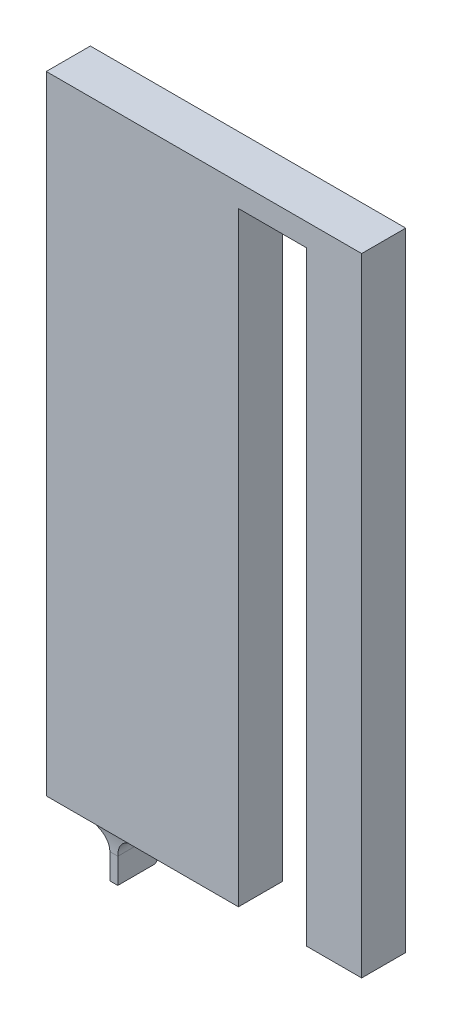
ISO-10303-21;
HEADER;
FILE_DESCRIPTION(('STEP AP214'),'2;1');
FILE_NAME('part.step','',(''),(''),'','','');
FILE_SCHEMA(('AUTOMOTIVE_DESIGN { 1 0 10303 214 1 1 1 1 }'));
ENDSEC;
DATA;
#1=APPLICATION_CONTEXT('core data for automotive mechanical design processes');
#2=APPLICATION_PROTOCOL_DEFINITION('international standard','automotive_design',2000,#1);
#3=PRODUCT_CONTEXT('',#1,'mechanical');
#4=PRODUCT('Part','Part','',(#3));
#5=PRODUCT_RELATED_PRODUCT_CATEGORY('part','',(#4));
#6=PRODUCT_DEFINITION_FORMATION('','',#4);
#7=PRODUCT_DEFINITION_CONTEXT('part definition',#1,'design');
#8=PRODUCT_DEFINITION('design','',#6,#7);
#9=PRODUCT_DEFINITION_SHAPE('','',#8);
#10=(LENGTH_UNIT() NAMED_UNIT(*) SI_UNIT(.MILLI.,.METRE.));
#11=(NAMED_UNIT(*) PLANE_ANGLE_UNIT() SI_UNIT($,.RADIAN.));
#12=(NAMED_UNIT(*) SI_UNIT($,.STERADIAN.) SOLID_ANGLE_UNIT());
#13=UNCERTAINTY_MEASURE_WITH_UNIT(LENGTH_MEASURE(1.E-05),#10,'distance_accuracy_value','');
#14=(GEOMETRIC_REPRESENTATION_CONTEXT(3) GLOBAL_UNCERTAINTY_ASSIGNED_CONTEXT((#13)) GLOBAL_UNIT_ASSIGNED_CONTEXT((#10,
#11,#12)) REPRESENTATION_CONTEXT('',''));
#15=CARTESIAN_POINT('',(0.,0.,0.));
#16=DIRECTION('',(0.,0.,1.));
#17=DIRECTION('',(1.,0.,0.));
#18=AXIS2_PLACEMENT_3D('',#15,#16,#17);
#19=CARTESIAN_POINT('',(2.62158154859967,-22.9950563906967,8.25));
#20=DIRECTION('',(0.,1.,0.));
#21=DIRECTION('',(-1.,0.,0.));
#22=AXIS2_PLACEMENT_3D('',#19,#20,#21);
#23=PLANE('',#22);
#24=DIRECTION('',(-1.,0.,0.));
#25=VECTOR('',#24,1.);
#26=CARTESIAN_POINT('',(2.62158154859968,-22.9950563906967,12.3));
#27=LINE('',#26,#25);
#28=CARTESIAN_POINT('',(-25.2784184514004,-22.9950563906967,12.3));
#29=VERTEX_POINT('',#28);
#30=CARTESIAN_POINT('',(8.72158154859968,-22.9950563906967,12.3));
#31=VERTEX_POINT('',#30);
#32=EDGE_CURVE('E328',#29,#31,#27,.F.);
#33=ORIENTED_EDGE('',*,*,#32,.F.);
#34=DIRECTION('',(0.,0.,1.));
#35=VECTOR('',#34,1.);
#36=CARTESIAN_POINT('',(-25.2784184514004,-22.9950563906967,6.));
#37=LINE('',#36,#35);
#38=CARTESIAN_POINT('',(-25.2784184514004,-22.9950563906967,4.5));
#39=VERTEX_POINT('',#38);
#40=EDGE_CURVE('E36',#39,#29,#37,.T.);
#41=ORIENTED_EDGE('',*,*,#40,.F.);
#42=DIRECTION('',(-1.,0.,0.));
#43=VECTOR('',#42,1.);
#44=CARTESIAN_POINT('',(2.62158154859968,-22.9950563906967,4.5));
#45=LINE('',#44,#43);
#46=CARTESIAN_POINT('',(-18.0284184514003,-22.9950563906967,4.5));
#47=VERTEX_POINT('',#46);
#48=EDGE_CURVE('E193',#47,#39,#45,.T.);
#49=ORIENTED_EDGE('',*,*,#48,.F.);
#50=DIRECTION('',(0.,0.,1.));
#51=VECTOR('',#50,1.);
#52=CARTESIAN_POINT('',(-18.0284184514003,-22.9950563906967,8.25));
#53=LINE('',#52,#51);
#54=CARTESIAN_POINT('',(-18.0284184514003,-22.9950563906967,12.));
#55=VERTEX_POINT('',#54);
#56=EDGE_CURVE('E11',#47,#55,#53,.T.);
#57=ORIENTED_EDGE('',*,*,#56,.T.);
#58=DIRECTION('',(-1.,0.,0.));
#59=VECTOR('',#58,1.);
#60=CARTESIAN_POINT('',(2.62158154859968,-22.9950563906967,12.));
#61=LINE('',#60,#59);
#62=CARTESIAN_POINT('',(-10.2284184514003,-22.9950563906967,12.));
#63=VERTEX_POINT('',#62);
#64=EDGE_CURVE('E27',#55,#63,#61,.F.);
#65=ORIENTED_EDGE('',*,*,#64,.T.);
#66=DIRECTION('',(0.,0.,-1.));
#67=VECTOR('',#66,1.);
#68=CARTESIAN_POINT('',(-10.2284184514003,-22.9950563906967,8.25));
#69=LINE('',#68,#67);
#70=CARTESIAN_POINT('',(-10.2284184514003,-22.9950563906967,4.5));
#71=VERTEX_POINT('',#70);
#72=EDGE_CURVE('E288',#63,#71,#69,.T.);
#73=ORIENTED_EDGE('',*,*,#72,.T.);
#74=DIRECTION('',(-1.,0.,0.));
#75=VECTOR('',#74,1.);
#76=CARTESIAN_POINT('',(2.62158154859968,-22.9950563906967,4.5));
#77=LINE('',#76,#75);
#78=CARTESIAN_POINT('',(8.72158154859968,-22.9950563906967,4.5));
#79=VERTEX_POINT('',#78);
#80=EDGE_CURVE('E215',#79,#71,#77,.T.);
#81=ORIENTED_EDGE('',*,*,#80,.F.);
#82=DIRECTION('',(0.,0.,-1.));
#83=VECTOR('',#82,1.);
#84=CARTESIAN_POINT('',(8.72158154859968,-22.9950563906967,12.));
#85=LINE('',#84,#83);
#86=EDGE_CURVE('E323',#31,#79,#85,.T.);
#87=ORIENTED_EDGE('',*,*,#86,.F.);
#88=EDGE_LOOP('',(#33,#41,#49,#57,#65,#73,#81,#87));
#89=FACE_BOUND('',#88,.T.);
#90=ADVANCED_FACE('F16',(#89),#23,.F.);
#91=CARTESIAN_POINT('',(2.62158154859968,-26.7031556342445,25.5));
#92=DIRECTION('',(-1.,0.,0.));
#93=DIRECTION('',(0.,1.,0.));
#94=AXIS2_PLACEMENT_3D('',#91,#92,#93);
#95=CYLINDRICAL_SURFACE('',#94,14.);
#96=ORIENTED_EDGE('',*,*,#64,.F.);
#97=CARTESIAN_POINT('',(-8.90078954420559,-26.7031556342445,25.5));
#98=DIRECTION('',(-0.376377046955935,-0.926466577122311,0.));
#99=DIRECTION('',(-0.926466577122311,0.376377046955935,0.));
#100=AXIS2_PLACEMENT_3D('',#97,#98,#99);
#101=ELLIPSE('',#100,37.1967422382138,14.);
#102=CARTESIAN_POINT('',(-17.0734610870232,-23.3830078199749,11.8993890397747));
#103=VERTEX_POINT('',#102);
#104=EDGE_CURVE('E285',#55,#103,#101,.T.);
#105=ORIENTED_EDGE('',*,*,#104,.T.);
#106=CARTESIAN_POINT('',(-14.8284502533945,-26.7031556342445,11.5));
#107=CARTESIAN_POINT('',(-14.8288570926695,-26.6036251122427,11.4999899226614));
#108=CARTESIAN_POINT('',(-14.8334144367716,-26.5041187415138,11.5010611644924));
#109=CARTESIAN_POINT('',(-14.850737728207,-26.3058833097149,11.5052892816952));
#110=CARTESIAN_POINT('',(-14.8635023529114,-26.2071541259931,11.5084458210171));
#111=CARTESIAN_POINT('',(-14.8971134184089,-26.0113709174898,11.5167590240632));
#112=CARTESIAN_POINT('',(-14.9179431972704,-25.9143138672088,11.5219115642278));
#113=CARTESIAN_POINT('',(-14.9674928558117,-25.7223805266506,11.5340648150103));
#114=CARTESIAN_POINT('',(-14.9962128190122,-25.6275042594694,11.5410655451919));
#115=CARTESIAN_POINT('',(-15.0938890068714,-25.3471636351645,11.5645669607288));
#116=CARTESIAN_POINT('',(-15.1743969281867,-25.1657831124523,11.5835761356008));
#117=CARTESIAN_POINT('',(-15.3637450890408,-24.8191118581225,11.6262473495391));
#118=CARTESIAN_POINT('',(-15.4725990023281,-24.6538289448052,11.6499116328197));
#119=CARTESIAN_POINT('',(-15.7180620165408,-24.3403969264178,11.6998892297625));
#120=CARTESIAN_POINT('',(-15.8551765260683,-24.1926503856293,11.7262456095506));
#121=CARTESIAN_POINT('',(-16.1521190429208,-23.9220876237806,11.7783138161174));
#122=CARTESIAN_POINT('',(-16.3119279550939,-23.7992506525712,11.8040261636058));
#123=CARTESIAN_POINT('',(-16.5745839627879,-23.6302883588266,11.8412552222447));
#124=CARTESIAN_POINT('',(-16.6710907249773,-23.5743672926204,11.8539930035461));
#125=CARTESIAN_POINT('',(-16.8688597633398,-23.4717253650382,11.877937402821));
#126=CARTESIAN_POINT('',(-16.9701141928896,-23.4249899429818,11.8891464353229));
#127=CARTESIAN_POINT('',(-17.0734610916875,-23.38300781808,11.8993890402373));
#128=B_SPLINE_CURVE_WITH_KNOTS('',3,(#106,#107,#108,#109,#110,#111,#112,#113,#114,#115,#116,
#117,#118,#119,#120,#121,#122,#123,#124,#125,#126,#127),.UNSPECIFIED.,.F.,.F.,(4,2,2,2,2,2,2,2,
2,2,4),(0.,0.298490699557289,0.596933308460145,0.894762621689849,1.19259508768848,
1.78764507758937,2.38298264554818,2.99007060464795,3.59665075140177,3.93300293697407,
4.26881757383742),.UNSPECIFIED.);
#129=CARTESIAN_POINT('',(-14.8284502533945,-26.7031556342445,11.5));
#130=VERTEX_POINT('',#129);
#131=EDGE_CURVE('E259',#130,#103,#128,.T.);
#132=ORIENTED_EDGE('',*,*,#131,.F.);
#133=DIRECTION('',(1.,0.,0.));
#134=VECTOR('',#133,1.);
#135=CARTESIAN_POINT('',(2.62158154859968,-26.7031556342445,11.5));
#136=LINE('',#135,#134);
#137=CARTESIAN_POINT('',(-13.4283866494062,-26.7031556342445,11.5));
#138=VERTEX_POINT('',#137);
#139=EDGE_CURVE('E284',#130,#138,#136,.T.);
#140=ORIENTED_EDGE('',*,*,#139,.T.);
#141=CARTESIAN_POINT('',(-13.4283866494062,-26.7031556342445,11.5));
#142=CARTESIAN_POINT('',(-13.4279798101311,-26.6036251122427,11.4999899226614));
#143=CARTESIAN_POINT('',(-13.4234224660291,-26.5041187415138,11.5010611644924));
#144=CARTESIAN_POINT('',(-13.4060991745937,-26.3058833097148,11.5052892816952));
#145=CARTESIAN_POINT('',(-13.3933345498893,-26.2071541259931,11.5084458210171));
#146=CARTESIAN_POINT('',(-13.3597234843918,-26.0113709174898,11.5167590240632));
#147=CARTESIAN_POINT('',(-13.3388937055302,-25.9143138672088,11.5219115642278));
#148=CARTESIAN_POINT('',(-13.289344046989,-25.7223805266506,11.5340648150103));
#149=CARTESIAN_POINT('',(-13.2606240837885,-25.6275042594694,11.5410655451919));
#150=CARTESIAN_POINT('',(-13.1629478959293,-25.3471636351645,11.5645669607288));
#151=CARTESIAN_POINT('',(-13.082439974614,-25.1657831124523,11.5835761356008));
#152=CARTESIAN_POINT('',(-12.8930918137599,-24.8191118581225,11.6262473495391));
#153=CARTESIAN_POINT('',(-12.7842379004726,-24.6538289448052,11.6499116328197));
#154=CARTESIAN_POINT('',(-12.5387748862598,-24.3403969264178,11.6998892297625));
#155=CARTESIAN_POINT('',(-12.4016603767324,-24.1926503856293,11.7262456095506));
#156=CARTESIAN_POINT('',(-12.1047178598798,-23.9220876237806,11.7783138161174));
#157=CARTESIAN_POINT('',(-11.9449089477067,-23.7992506525712,11.8040261636058));
#158=CARTESIAN_POINT('',(-11.6822529400128,-23.6302883588266,11.8412552222447));
#159=CARTESIAN_POINT('',(-11.5857461778234,-23.5743672926204,11.8539930035461));
#160=CARTESIAN_POINT('',(-11.3879771394609,-23.4717253650382,11.877937402821));
#161=CARTESIAN_POINT('',(-11.2867227099111,-23.4249899429818,11.8891464353229));
#162=CARTESIAN_POINT('',(-11.1833758111131,-23.38300781808,11.8993890402373));
#163=B_SPLINE_CURVE_WITH_KNOTS('',3,(#141,#142,#143,#144,#145,#146,#147,#148,#149,#150,#151,
#152,#153,#154,#155,#156,#157,#158,#159,#160,#161,#162),.UNSPECIFIED.,.F.,.F.,(4,2,2,2,2,2,2,2,
2,2,4),(0.,0.298490699557289,0.596933308460142,0.894762621689845,1.19259508768848,
1.78764507758937,2.38298264554818,2.99007060464795,3.59665075140176,3.93300293697407,
4.26881757383742),.UNSPECIFIED.);
#164=CARTESIAN_POINT('',(-11.1833758157774,-23.3830078199749,11.8993890397747));
#165=VERTEX_POINT('',#164);
#166=EDGE_CURVE('E249',#138,#165,#163,.T.);
#167=ORIENTED_EDGE('',*,*,#166,.T.);
#168=CARTESIAN_POINT('',(-19.3560473585951,-26.7031556342445,25.5));
#169=DIRECTION('',(0.376377046955934,-0.926466577122311,0.));
#170=DIRECTION('',(-0.926466577122311,-0.376377046955934,0.));
#171=AXIS2_PLACEMENT_3D('',#168,#169,#170);
#172=ELLIPSE('',#171,37.1967422382139,14.);
#173=EDGE_CURVE('E267',#63,#165,#172,.F.);
#174=ORIENTED_EDGE('',*,*,#173,.F.);
#175=EDGE_LOOP('',(#96,#105,#132,#140,#167,#174));
#176=FACE_BOUND('',#175,.T.);
#177=ADVANCED_FACE('F271',(#176),#95,.F.);
#178=CARTESIAN_POINT('',(-6.10341845140052,-30.9950563906967,4.7));
#179=DIRECTION('',(0.,-0.707106781186543,-0.707106781186552));
#180=DIRECTION('',(0.,0.707106781186552,-0.707106781186543));
#181=AXIS2_PLACEMENT_3D('',#178,#179,#180);
#182=PLANE('',#181);
#183=DIRECTION('',(0.,0.707106781186552,-0.707106781186543));
#184=VECTOR('',#183,1.);
#185=CARTESIAN_POINT('',(-14.8284184514003,-30.9950563906967,4.70000000000003));
#186=LINE('',#185,#184);
#187=CARTESIAN_POINT('',(-14.8284184514003,-31.1950563906967,4.9));
#188=VERTEX_POINT('',#187);
#189=CARTESIAN_POINT('',(-14.8284184514003,-30.7950563906967,4.5));
#190=VERTEX_POINT('',#189);
#191=EDGE_CURVE('E246',#188,#190,#186,.T.);
#192=ORIENTED_EDGE('',*,*,#191,.T.);
#193=DIRECTION('',(-1.,0.,0.));
#194=VECTOR('',#193,1.);
#195=CARTESIAN_POINT('',(-6.10341845140052,-30.7950563906967,4.5));
#196=LINE('',#195,#194);
#197=CARTESIAN_POINT('',(-13.4284184514003,-30.7950563906967,4.5));
#198=VERTEX_POINT('',#197);
#199=EDGE_CURVE('E226',#190,#198,#196,.F.);
#200=ORIENTED_EDGE('',*,*,#199,.T.);
#201=DIRECTION('',(0.,-0.707106781186552,0.707106781186543));
#202=VECTOR('',#201,1.);
#203=CARTESIAN_POINT('',(-13.4284184514003,-30.9950563906967,4.70000000000002));
#204=LINE('',#203,#202);
#205=CARTESIAN_POINT('',(-13.4284184514003,-31.1950563906967,4.9));
#206=VERTEX_POINT('',#205);
#207=EDGE_CURVE('E238',#198,#206,#204,.T.);
#208=ORIENTED_EDGE('',*,*,#207,.T.);
#209=DIRECTION('',(-1.,0.,0.));
#210=VECTOR('',#209,1.);
#211=CARTESIAN_POINT('',(-6.10341845140052,-31.1950563906967,4.9));
#212=LINE('',#211,#210);
#213=EDGE_CURVE('E242',#206,#188,#212,.T.);
#214=ORIENTED_EDGE('',*,*,#213,.T.);
#215=EDGE_LOOP('',(#192,#200,#208,#214));
#216=FACE_BOUND('',#215,.T.);
#217=ADVANCED_FACE('F244',(#216),#182,.T.);
#218=CARTESIAN_POINT('',(-14.8284184514003,-26.71828749951,4.5));
#219=DIRECTION('',(-1.,0.,0.));
#220=DIRECTION('',(0.,0.,1.));
#221=AXIS2_PLACEMENT_3D('',#218,#219,#220);
#222=PLANE('',#221);
#223=ORIENTED_EDGE('',*,*,#191,.F.);
#224=DIRECTION('',(0.,0.,1.));
#225=VECTOR('',#224,1.);
#226=CARTESIAN_POINT('',(-14.8284184514003,-31.1950563906967,4.5));
#227=LINE('',#226,#225);
#228=CARTESIAN_POINT('',(-14.8284184514003,-31.1950563906967,11.5));
#229=VERTEX_POINT('',#228);
#230=EDGE_CURVE('E254',#188,#229,#227,.T.);
#231=ORIENTED_EDGE('',*,*,#230,.T.);
#232=DIRECTION('',(0.,1.,0.));
#233=VECTOR('',#232,1.);
#234=CARTESIAN_POINT('',(-14.8284184514003,-27.0950563906967,11.5));
#235=LINE('',#234,#233);
#236=CARTESIAN_POINT('',(-14.8284184514003,-26.71828749951,11.5));
#237=VERTEX_POINT('',#236);
#238=EDGE_CURVE('E313',#237,#229,#235,.F.);
#239=ORIENTED_EDGE('',*,*,#238,.F.);
#240=DIRECTION('',(0.,0.,1.));
#241=VECTOR('',#240,1.);
#242=CARTESIAN_POINT('',(-14.8284184514003,-26.71828749951,4.5));
#243=LINE('',#242,#241);
#244=CARTESIAN_POINT('',(-14.8284184514003,-26.71828749951,4.5));
#245=VERTEX_POINT('',#244);
#246=EDGE_CURVE('E258',#245,#237,#243,.T.);
#247=ORIENTED_EDGE('',*,*,#246,.F.);
#248=DIRECTION('',(0.,-1.,0.));
#249=VECTOR('',#248,1.);
#250=CARTESIAN_POINT('',(-14.8284184514003,25.5049436093033,4.5));
#251=LINE('',#250,#249);
#252=EDGE_CURVE('E189',#190,#245,#251,.F.);
#253=ORIENTED_EDGE('',*,*,#252,.F.);
#254=EDGE_LOOP('',(#223,#231,#239,#247,#253));
#255=FACE_BOUND('',#254,.T.);
#256=ADVANCED_FACE('F357',(#255),#222,.T.);
#257=CARTESIAN_POINT('',(-14.8284184514003,-31.1950563906967,4.5));
#258=DIRECTION('',(0.,-1.,0.));
#259=DIRECTION('',(1.,0.,0.));
#260=AXIS2_PLACEMENT_3D('',#257,#258,#259);
#261=PLANE('',#260);
#262=ORIENTED_EDGE('',*,*,#213,.F.);
#263=DIRECTION('',(0.,0.,1.));
#264=VECTOR('',#263,1.);
#265=CARTESIAN_POINT('',(-13.4284184514003,-31.1950563906967,4.5));
#266=LINE('',#265,#264);
#267=CARTESIAN_POINT('',(-13.4284184514003,-31.1950563906967,11.5));
#268=VERTEX_POINT('',#267);
#269=EDGE_CURVE('E240',#206,#268,#266,.T.);
#270=ORIENTED_EDGE('',*,*,#269,.T.);
#271=DIRECTION('',(-1.,0.,0.));
#272=VECTOR('',#271,1.);
#273=CARTESIAN_POINT('',(-14.1284184514004,-31.1950563906967,11.5));
#274=LINE('',#273,#272);
#275=EDGE_CURVE('E315',#229,#268,#274,.F.);
#276=ORIENTED_EDGE('',*,*,#275,.F.);
#277=ORIENTED_EDGE('',*,*,#230,.F.);
#278=EDGE_LOOP('',(#262,#270,#276,#277));
#279=FACE_BOUND('',#278,.T.);
#280=ADVANCED_FACE('F360',(#279),#261,.T.);
#281=CARTESIAN_POINT('',(-18.4284184514003,-26.71828749951,4.5));
#282=DIRECTION('',(0.,0.,1.));
#283=DIRECTION('',(1.,0.,0.));
#284=AXIS2_PLACEMENT_3D('',#281,#282,#283);
#285=CYLINDRICAL_SURFACE('',#284,3.6);
#286=CARTESIAN_POINT('',(-18.4284184514003,-26.71828749951,4.5));
#287=DIRECTION('',(0.,0.,1.));
#288=DIRECTION('',(1.,0.,0.));
#289=AXIS2_PLACEMENT_3D('',#286,#287,#288);
#290=CIRCLE('',#289,3.6);
#291=CARTESIAN_POINT('',(-17.073461082359,-23.3830078218697,4.5));
#292=VERTEX_POINT('',#291);
#293=EDGE_CURVE('E209',#245,#292,#290,.T.);
#294=ORIENTED_EDGE('',*,*,#293,.F.);
#295=ORIENTED_EDGE('',*,*,#246,.T.);
#296=CARTESIAN_POINT('',(-18.4284184514003,-26.71828749951,11.5));
#297=DIRECTION('',(0.,0.,-1.));
#298=DIRECTION('',(-1.,0.,0.));
#299=AXIS2_PLACEMENT_3D('',#296,#297,#298);
#300=CIRCLE('',#299,3.6);
#301=EDGE_CURVE('E301',#130,#237,#300,.T.);
#302=ORIENTED_EDGE('',*,*,#301,.F.);
#303=ORIENTED_EDGE('',*,*,#131,.T.);
#304=DIRECTION('',(0.,0.,1.));
#305=VECTOR('',#304,1.);
#306=CARTESIAN_POINT('',(-17.073461082359,-23.3830078218697,4.5));
#307=LINE('',#306,#305);
#308=EDGE_CURVE('E266',#292,#103,#307,.T.);
#309=ORIENTED_EDGE('',*,*,#308,.F.);
#310=EDGE_LOOP('',(#294,#295,#302,#303,#309));
#311=FACE_BOUND('',#310,.T.);
#312=ADVANCED_FACE('F269',(#311),#285,.F.);
#313=CARTESIAN_POINT('',(-18.0284184514003,-22.9950563906967,4.5));
#314=DIRECTION('',(-0.376377046955935,-0.926466577122311,0.));
#315=DIRECTION('',(0.926466577122311,-0.376377046955935,0.));
#316=AXIS2_PLACEMENT_3D('',#313,#314,#315);
#317=PLANE('',#316);
#318=ORIENTED_EDGE('',*,*,#56,.F.);
#319=DIRECTION('',(0.926466577122311,-0.376377046955935,0.));
#320=VECTOR('',#319,1.);
#321=CARTESIAN_POINT('',(-17.2156774622971,-23.3252324175199,4.5));
#322=LINE('',#321,#320);
#323=EDGE_CURVE('E211',#292,#47,#322,.F.);
#324=ORIENTED_EDGE('',*,*,#323,.F.);
#325=ORIENTED_EDGE('',*,*,#308,.T.);
#326=ORIENTED_EDGE('',*,*,#104,.F.);
#327=EDGE_LOOP('',(#318,#324,#325,#326));
#328=FACE_BOUND('',#327,.T.);
#329=ADVANCED_FACE('F364',(#328),#317,.T.);
#330=CARTESIAN_POINT('',(-11.1833758204417,-23.3830078218697,4.5));
#331=DIRECTION('',(0.376377046955934,-0.926466577122311,0.));
#332=DIRECTION('',(0.926466577122311,0.376377046955934,0.));
#333=AXIS2_PLACEMENT_3D('',#330,#331,#332);
#334=PLANE('',#333);
#335=ORIENTED_EDGE('',*,*,#173,.T.);
#336=DIRECTION('',(0.,0.,1.));
#337=VECTOR('',#336,1.);
#338=CARTESIAN_POINT('',(-11.1833758204417,-23.3830078218697,4.5));
#339=LINE('',#338,#337);
#340=CARTESIAN_POINT('',(-11.1833758204417,-23.3830078218697,4.5));
#341=VERTEX_POINT('',#340);
#342=EDGE_CURVE('E295',#341,#165,#339,.T.);
#343=ORIENTED_EDGE('',*,*,#342,.F.);
#344=DIRECTION('',(0.926466577122311,0.376377046955934,0.));
#345=VECTOR('',#344,1.);
#346=CARTESIAN_POINT('',(17.7132412300748,-11.6437571450975,4.5));
#347=LINE('',#346,#345);
#348=EDGE_CURVE('E217',#71,#341,#347,.F.);
#349=ORIENTED_EDGE('',*,*,#348,.F.);
#350=ORIENTED_EDGE('',*,*,#72,.F.);
#351=EDGE_LOOP('',(#335,#343,#349,#350));
#352=FACE_BOUND('',#351,.T.);
#353=ADVANCED_FACE('F367',(#352),#334,.T.);
#354=CARTESIAN_POINT('',(-9.82841845140034,-26.71828749951,4.5));
#355=DIRECTION('',(0.,0.,1.));
#356=DIRECTION('',(1.,0.,0.));
#357=AXIS2_PLACEMENT_3D('',#354,#355,#356);
#358=CYLINDRICAL_SURFACE('',#357,3.6);
#359=CARTESIAN_POINT('',(-9.82841845140034,-26.71828749951,4.5));
#360=DIRECTION('',(0.,0.,1.));
#361=DIRECTION('',(1.,0.,0.));
#362=AXIS2_PLACEMENT_3D('',#359,#360,#361);
#363=CIRCLE('',#362,3.6);
#364=CARTESIAN_POINT('',(-13.4284184514003,-26.71828749951,4.5));
#365=VERTEX_POINT('',#364);
#366=EDGE_CURVE('E219',#341,#365,#363,.T.);
#367=ORIENTED_EDGE('',*,*,#366,.F.);
#368=ORIENTED_EDGE('',*,*,#342,.T.);
#369=ORIENTED_EDGE('',*,*,#166,.F.);
#370=CARTESIAN_POINT('',(-9.82841845140034,-26.71828749951,11.5));
#371=DIRECTION('',(0.,0.,-1.));
#372=DIRECTION('',(-1.,0.,0.));
#373=AXIS2_PLACEMENT_3D('',#370,#371,#372);
#374=CIRCLE('',#373,3.6);
#375=CARTESIAN_POINT('',(-13.4284184514003,-26.71828749951,11.5));
#376=VERTEX_POINT('',#375);
#377=EDGE_CURVE('E321',#376,#138,#374,.T.);
#378=ORIENTED_EDGE('',*,*,#377,.F.);
#379=DIRECTION('',(0.,0.,1.));
#380=VECTOR('',#379,1.);
#381=CARTESIAN_POINT('',(-13.4284184514003,-26.71828749951,4.5));
#382=LINE('',#381,#380);
#383=EDGE_CURVE('E234',#365,#376,#382,.T.);
#384=ORIENTED_EDGE('',*,*,#383,.F.);
#385=EDGE_LOOP('',(#367,#368,#369,#378,#384));
#386=FACE_BOUND('',#385,.T.);
#387=ADVANCED_FACE('F18',(#386),#358,.F.);
#388=CARTESIAN_POINT('',(-13.4284184514003,-31.1950563906967,4.5));
#389=DIRECTION('',(1.,0.,0.));
#390=DIRECTION('',(0.,1.,0.));
#391=AXIS2_PLACEMENT_3D('',#388,#389,#390);
#392=PLANE('',#391);
#393=ORIENTED_EDGE('',*,*,#207,.F.);
#394=DIRECTION('',(0.,1.,0.));
#395=VECTOR('',#394,1.);
#396=CARTESIAN_POINT('',(-13.4284184514003,25.5049436093033,4.5));
#397=LINE('',#396,#395);
#398=EDGE_CURVE('E221',#365,#198,#397,.F.);
#399=ORIENTED_EDGE('',*,*,#398,.F.);
#400=ORIENTED_EDGE('',*,*,#383,.T.);
#401=DIRECTION('',(0.,-1.,0.));
#402=VECTOR('',#401,1.);
#403=CARTESIAN_POINT('',(-13.4284184514003,-27.0950563906967,11.5));
#404=LINE('',#403,#402);
#405=EDGE_CURVE('E319',#268,#376,#404,.F.);
#406=ORIENTED_EDGE('',*,*,#405,.F.);
#407=ORIENTED_EDGE('',*,*,#269,.F.);
#408=EDGE_LOOP('',(#393,#399,#400,#406,#407));
#409=FACE_BOUND('',#408,.T.);
#410=ADVANCED_FACE('F232',(#409),#392,.T.);
#411=CARTESIAN_POINT('',(-14.1284184514003,-27.0950563906967,11.5));
#412=DIRECTION('',(0.,0.,-1.));
#413=DIRECTION('',(-1.,0.,0.));
#414=AXIS2_PLACEMENT_3D('',#411,#412,#413);
#415=PLANE('',#414);
#416=ORIENTED_EDGE('',*,*,#139,.F.);
#417=ORIENTED_EDGE('',*,*,#301,.T.);
#418=ORIENTED_EDGE('',*,*,#238,.T.);
#419=ORIENTED_EDGE('',*,*,#275,.T.);
#420=ORIENTED_EDGE('',*,*,#405,.T.);
#421=ORIENTED_EDGE('',*,*,#377,.T.);
#422=EDGE_LOOP('',(#416,#417,#418,#419,#420,#421));
#423=FACE_BOUND('',#422,.T.);
#424=ADVANCED_FACE('F312',(#423),#415,.F.);
#425=CARTESIAN_POINT('',(2.62158154859967,-22.9950563906967,8.25));
#426=DIRECTION('',(0.,1.,0.));
#427=DIRECTION('',(-1.,0.,0.));
#428=AXIS2_PLACEMENT_3D('',#425,#426,#427);
#429=PLANE('',#428);
#430=DIRECTION('',(0.,0.,1.));
#431=VECTOR('',#430,1.);
#432=CARTESIAN_POINT('',(20.7215815485997,-22.9950563906967,12.));
#433=LINE('',#432,#431);
#434=CARTESIAN_POINT('',(20.7215815485997,-22.9950563906967,4.5));
#435=VERTEX_POINT('',#434);
#436=CARTESIAN_POINT('',(20.7215815485997,-22.9950563906967,12.3));
#437=VERTEX_POINT('',#436);
#438=EDGE_CURVE('E168',#435,#437,#433,.T.);
#439=ORIENTED_EDGE('',*,*,#438,.F.);
#440=DIRECTION('',(-1.,0.,0.));
#441=VECTOR('',#440,1.);
#442=CARTESIAN_POINT('',(2.62158154859968,-22.9950563906967,4.5));
#443=LINE('',#442,#441);
#444=CARTESIAN_POINT('',(30.5215815485997,-22.9950563906967,4.5));
#445=VERTEX_POINT('',#444);
#446=EDGE_CURVE('E161',#445,#435,#443,.T.);
#447=ORIENTED_EDGE('',*,*,#446,.F.);
#448=DIRECTION('',(0.,0.,-1.));
#449=VECTOR('',#448,1.);
#450=CARTESIAN_POINT('',(30.5215815485997,-22.9950563906967,6.));
#451=LINE('',#450,#449);
#452=CARTESIAN_POINT('',(30.5215815485997,-22.9950563906967,12.3));
#453=VERTEX_POINT('',#452);
#454=EDGE_CURVE('E188',#453,#445,#451,.T.);
#455=ORIENTED_EDGE('',*,*,#454,.F.);
#456=DIRECTION('',(-1.,0.,0.));
#457=VECTOR('',#456,1.);
#458=CARTESIAN_POINT('',(2.62158154859968,-22.9950563906967,12.3));
#459=LINE('',#458,#457);
#460=EDGE_CURVE('E203',#437,#453,#459,.F.);
#461=ORIENTED_EDGE('',*,*,#460,.F.);
#462=EDGE_LOOP('',(#439,#447,#455,#461));
#463=FACE_BOUND('',#462,.T.);
#464=ADVANCED_FACE('F337',(#463),#429,.F.);
#465=CARTESIAN_POINT('',(8.72158154859968,-35.9950563906967,12.));
#466=DIRECTION('',(-1.,0.,0.));
#467=DIRECTION('',(0.,-1.,0.));
#468=AXIS2_PLACEMENT_3D('',#465,#466,#467);
#469=PLANE('',#468);
#470=ORIENTED_EDGE('',*,*,#86,.T.);
#471=DIRECTION('',(0.,1.,0.));
#472=VECTOR('',#471,1.);
#473=CARTESIAN_POINT('',(8.72158154859968,-35.9950563906967,4.5));
#474=LINE('',#473,#472);
#475=CARTESIAN_POINT('',(8.72158154859966,84.0049436093033,4.5));
#476=VERTEX_POINT('',#475);
#477=EDGE_CURVE('E326',#79,#476,#474,.T.);
#478=ORIENTED_EDGE('',*,*,#477,.T.);
#479=DIRECTION('',(0.,0.,1.));
#480=VECTOR('',#479,1.);
#481=CARTESIAN_POINT('',(8.72158154859966,84.0049436093033,12.));
#482=LINE('',#481,#480);
#483=CARTESIAN_POINT('',(8.72158154859966,84.0049436093033,12.3));
#484=VERTEX_POINT('',#483);
#485=EDGE_CURVE('E151',#484,#476,#482,.F.);
#486=ORIENTED_EDGE('',*,*,#485,.F.);
#487=DIRECTION('',(0.,-1.,0.));
#488=VECTOR('',#487,1.);
#489=CARTESIAN_POINT('',(8.72158154859967,25.5049436093033,12.3));
#490=LINE('',#489,#488);
#491=EDGE_CURVE('E330',#31,#484,#490,.F.);
#492=ORIENTED_EDGE('',*,*,#491,.F.);
#493=EDGE_LOOP('',(#470,#478,#486,#492));
#494=FACE_BOUND('',#493,.T.);
#495=ADVANCED_FACE('F339',(#494),#469,.F.);
#496=CARTESIAN_POINT('',(2.62158154859967,25.5049436093033,12.3));
#497=DIRECTION('',(0.,0.,1.));
#498=DIRECTION('',(1.,0.,0.));
#499=AXIS2_PLACEMENT_3D('',#496,#497,#498);
#500=PLANE('',#499);
#501=ORIENTED_EDGE('',*,*,#32,.T.);
#502=ORIENTED_EDGE('',*,*,#491,.T.);
#503=DIRECTION('',(-1.,0.,0.));
#504=VECTOR('',#503,1.);
#505=CARTESIAN_POINT('',(2.62158154859967,84.0049436093033,12.3));
#506=LINE('',#505,#504);
#507=CARTESIAN_POINT('',(20.7215815485997,84.0049436093033,12.3));
#508=VERTEX_POINT('',#507);
#509=EDGE_CURVE('E333',#484,#508,#506,.F.);
#510=ORIENTED_EDGE('',*,*,#509,.T.);
#511=DIRECTION('',(0.,1.,0.));
#512=VECTOR('',#511,1.);
#513=CARTESIAN_POINT('',(20.7215815485997,25.5049436093033,12.3));
#514=LINE('',#513,#512);
#515=EDGE_CURVE('E166',#508,#437,#514,.F.);
#516=ORIENTED_EDGE('',*,*,#515,.T.);
#517=ORIENTED_EDGE('',*,*,#460,.T.);
#518=DIRECTION('',(0.,-1.,0.));
#519=VECTOR('',#518,1.);
#520=CARTESIAN_POINT('',(30.5215815485997,25.5049436093033,12.3));
#521=LINE('',#520,#519);
#522=CARTESIAN_POINT('',(30.5215815485997,88.0049436093033,12.3));
#523=VERTEX_POINT('',#522);
#524=EDGE_CURVE('E201',#453,#523,#521,.F.);
#525=ORIENTED_EDGE('',*,*,#524,.T.);
#526=DIRECTION('',(-1.,0.,0.));
#527=VECTOR('',#526,1.);
#528=CARTESIAN_POINT('',(2.62158154859967,88.0049436093033,12.3));
#529=LINE('',#528,#527);
#530=CARTESIAN_POINT('',(-25.2784184514004,88.0049436093033,12.3));
#531=VERTEX_POINT('',#530);
#532=EDGE_CURVE('E181',#523,#531,#529,.T.);
#533=ORIENTED_EDGE('',*,*,#532,.T.);
#534=DIRECTION('',(0.,1.,0.));
#535=VECTOR('',#534,1.);
#536=CARTESIAN_POINT('',(-25.2784184514004,25.5049436093033,12.3));
#537=LINE('',#536,#535);
#538=EDGE_CURVE('E196',#531,#29,#537,.F.);
#539=ORIENTED_EDGE('',*,*,#538,.T.);
#540=EDGE_LOOP('',(#501,#502,#510,#516,#517,#525,#533,#539));
#541=FACE_BOUND('',#540,.T.);
#542=ADVANCED_FACE('F199',(#541),#500,.T.);
#543=CARTESIAN_POINT('',(30.5215815485997,25.5049436093033,6.));
#544=DIRECTION('',(-1.,0.,0.));
#545=DIRECTION('',(0.,0.,1.));
#546=AXIS2_PLACEMENT_3D('',#543,#544,#545);
#547=PLANE('',#546);
#548=ORIENTED_EDGE('',*,*,#454,.T.);
#549=DIRECTION('',(0.,1.,0.));
#550=VECTOR('',#549,1.);
#551=CARTESIAN_POINT('',(30.5215815485997,25.5049436093033,4.5));
#552=LINE('',#551,#550);
#553=CARTESIAN_POINT('',(30.5215815485997,88.0049436093033,4.5));
#554=VERTEX_POINT('',#553);
#555=EDGE_CURVE('E186',#445,#554,#552,.T.);
#556=ORIENTED_EDGE('',*,*,#555,.T.);
#557=DIRECTION('',(0.,0.,1.));
#558=VECTOR('',#557,1.);
#559=CARTESIAN_POINT('',(30.5215815485997,88.0049436093033,0.));
#560=LINE('',#559,#558);
#561=EDGE_CURVE('E21',#523,#554,#560,.F.);
#562=ORIENTED_EDGE('',*,*,#561,.F.);
#563=ORIENTED_EDGE('',*,*,#524,.F.);
#564=EDGE_LOOP('',(#548,#556,#562,#563));
#565=FACE_BOUND('',#564,.T.);
#566=ADVANCED_FACE('F187',(#565),#547,.F.);
#567=CARTESIAN_POINT('',(2.62158154859966,25.5049436093033,4.5));
#568=DIRECTION('',(0.,0.,1.));
#569=DIRECTION('',(1.,0.,0.));
#570=AXIS2_PLACEMENT_3D('',#567,#568,#569);
#571=PLANE('',#570);
#572=ORIENTED_EDGE('',*,*,#199,.F.);
#573=ORIENTED_EDGE('',*,*,#252,.T.);
#574=ORIENTED_EDGE('',*,*,#293,.T.);
#575=ORIENTED_EDGE('',*,*,#323,.T.);
#576=ORIENTED_EDGE('',*,*,#48,.T.);
#577=DIRECTION('',(0.,-1.,0.));
#578=VECTOR('',#577,1.);
#579=CARTESIAN_POINT('',(-25.2784184514004,25.5049436093033,4.5));
#580=LINE('',#579,#578);
#581=CARTESIAN_POINT('',(-25.2784184514004,88.0049436093033,4.5));
#582=VERTEX_POINT('',#581);
#583=EDGE_CURVE('E170',#582,#39,#580,.T.);
#584=ORIENTED_EDGE('',*,*,#583,.F.);
#585=DIRECTION('',(1.,0.,0.));
#586=VECTOR('',#585,1.);
#587=CARTESIAN_POINT('',(30.5215815485997,88.0049436093033,4.5));
#588=LINE('',#587,#586);
#589=EDGE_CURVE('E139',#554,#582,#588,.F.);
#590=ORIENTED_EDGE('',*,*,#589,.F.);
#591=ORIENTED_EDGE('',*,*,#555,.F.);
#592=ORIENTED_EDGE('',*,*,#446,.T.);
#593=DIRECTION('',(0.,-1.,0.));
#594=VECTOR('',#593,1.);
#595=CARTESIAN_POINT('',(20.7215815485997,84.0049436093033,4.5));
#596=LINE('',#595,#594);
#597=CARTESIAN_POINT('',(20.7215815485997,84.0049436093033,4.5));
#598=VERTEX_POINT('',#597);
#599=EDGE_CURVE('E155',#598,#435,#596,.T.);
#600=ORIENTED_EDGE('',*,*,#599,.F.);
#601=DIRECTION('',(1.,0.,0.));
#602=VECTOR('',#601,1.);
#603=CARTESIAN_POINT('',(8.72158154859966,84.0049436093033,4.5));
#604=LINE('',#603,#602);
#605=EDGE_CURVE('E145',#476,#598,#604,.T.);
#606=ORIENTED_EDGE('',*,*,#605,.F.);
#607=ORIENTED_EDGE('',*,*,#477,.F.);
#608=ORIENTED_EDGE('',*,*,#80,.T.);
#609=ORIENTED_EDGE('',*,*,#348,.T.);
#610=ORIENTED_EDGE('',*,*,#366,.T.);
#611=ORIENTED_EDGE('',*,*,#398,.T.);
#612=EDGE_LOOP('',(#572,#573,#574,#575,#576,#584,#590,#591,#592,#600,#606,#607,#608,#609,#610,#611));
#613=FACE_BOUND('',#612,.T.);
#614=ADVANCED_FACE('F159',(#613),#571,.F.);
#615=CARTESIAN_POINT('',(-25.2784184514004,25.5049436093033,6.));
#616=DIRECTION('',(1.,0.,0.));
#617=DIRECTION('',(0.,0.,-1.));
#618=AXIS2_PLACEMENT_3D('',#615,#616,#617);
#619=PLANE('',#618);
#620=ORIENTED_EDGE('',*,*,#40,.T.);
#621=ORIENTED_EDGE('',*,*,#538,.F.);
#622=DIRECTION('',(0.,0.,-1.));
#623=VECTOR('',#622,1.);
#624=CARTESIAN_POINT('',(-25.2784184514004,88.0049436093033,0.));
#625=LINE('',#624,#623);
#626=EDGE_CURVE('E175',#582,#531,#625,.F.);
#627=ORIENTED_EDGE('',*,*,#626,.F.);
#628=ORIENTED_EDGE('',*,*,#583,.T.);
#629=EDGE_LOOP('',(#620,#621,#627,#628));
#630=FACE_BOUND('',#629,.T.);
#631=ADVANCED_FACE('F194',(#630),#619,.F.);
#632=CARTESIAN_POINT('',(20.7215815485997,84.0049436093033,12.));
#633=DIRECTION('',(1.,0.,0.));
#634=DIRECTION('',(0.,1.,0.));
#635=AXIS2_PLACEMENT_3D('',#632,#633,#634);
#636=PLANE('',#635);
#637=ORIENTED_EDGE('',*,*,#438,.T.);
#638=ORIENTED_EDGE('',*,*,#515,.F.);
#639=DIRECTION('',(0.,0.,1.));
#640=VECTOR('',#639,1.);
#641=CARTESIAN_POINT('',(20.7215815485997,84.0049436093033,12.));
#642=LINE('',#641,#640);
#643=EDGE_CURVE('E150',#508,#598,#642,.F.);
#644=ORIENTED_EDGE('',*,*,#643,.T.);
#645=ORIENTED_EDGE('',*,*,#599,.T.);
#646=EDGE_LOOP('',(#637,#638,#644,#645));
#647=FACE_BOUND('',#646,.T.);
#648=ADVANCED_FACE('F164',(#647),#636,.F.);
#649=CARTESIAN_POINT('',(8.72158154859966,84.0049436093033,12.));
#650=DIRECTION('',(0.,1.,0.));
#651=DIRECTION('',(0.,0.,1.));
#652=AXIS2_PLACEMENT_3D('',#649,#650,#651);
#653=PLANE('',#652);
#654=ORIENTED_EDGE('',*,*,#605,.T.);
#655=ORIENTED_EDGE('',*,*,#643,.F.);
#656=ORIENTED_EDGE('',*,*,#509,.F.);
#657=ORIENTED_EDGE('',*,*,#485,.T.);
#658=EDGE_LOOP('',(#654,#655,#656,#657));
#659=FACE_BOUND('',#658,.T.);
#660=ADVANCED_FACE('F147',(#659),#653,.F.);
#661=CARTESIAN_POINT('',(30.5215815485997,88.0049436093033,0.));
#662=DIRECTION('',(0.,1.,0.));
#663=DIRECTION('',(0.,0.,1.));
#664=AXIS2_PLACEMENT_3D('',#661,#662,#663);
#665=PLANE('',#664);
#666=ORIENTED_EDGE('',*,*,#589,.T.);
#667=ORIENTED_EDGE('',*,*,#626,.T.);
#668=ORIENTED_EDGE('',*,*,#532,.F.);
#669=ORIENTED_EDGE('',*,*,#561,.T.);
#670=EDGE_LOOP('',(#666,#667,#668,#669));
#671=FACE_BOUND('',#670,.T.);
#672=ADVANCED_FACE('F179',(#671),#665,.T.);
#673=CLOSED_SHELL('',(#90,#177,#217,#256,#280,#312,#329,#353,#387,#410,#424,#464,#495,#542,#566,
#614,#631,#648,#660,#672));
#674=MANIFOLD_SOLID_BREP('B1',#673);
#675=ADVANCED_BREP_SHAPE_REPRESENTATION('',(#18,#674),#14);
#676=SHAPE_DEFINITION_REPRESENTATION(#9,#675);
ENDSEC;
END-ISO-10303-21;
